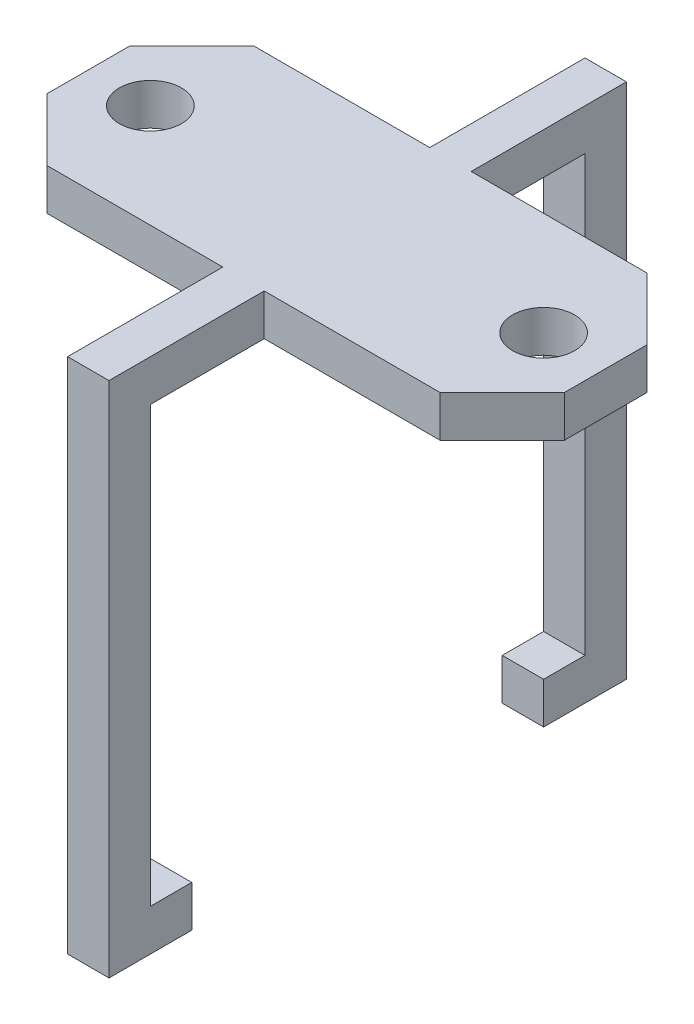
ISO-10303-21;
HEADER;
FILE_DESCRIPTION(('STEP AP214'),'2;1');
FILE_NAME('part.step','',(''),(''),'','','');
FILE_SCHEMA(('AUTOMOTIVE_DESIGN { 1 0 10303 214 1 1 1 1 }'));
ENDSEC;
DATA;
#1=APPLICATION_CONTEXT('core data for automotive mechanical design processes');
#2=APPLICATION_PROTOCOL_DEFINITION('international standard','automotive_design',2000,#1);
#3=PRODUCT_CONTEXT('',#1,'mechanical');
#4=PRODUCT('Part','Part','',(#3));
#5=PRODUCT_RELATED_PRODUCT_CATEGORY('part','',(#4));
#6=PRODUCT_DEFINITION_FORMATION('','',#4);
#7=PRODUCT_DEFINITION_CONTEXT('part definition',#1,'design');
#8=PRODUCT_DEFINITION('design','',#6,#7);
#9=PRODUCT_DEFINITION_SHAPE('','',#8);
#10=(LENGTH_UNIT() NAMED_UNIT(*) SI_UNIT(.MILLI.,.METRE.));
#11=(NAMED_UNIT(*) PLANE_ANGLE_UNIT() SI_UNIT($,.RADIAN.));
#12=(NAMED_UNIT(*) SI_UNIT($,.STERADIAN.) SOLID_ANGLE_UNIT());
#13=UNCERTAINTY_MEASURE_WITH_UNIT(LENGTH_MEASURE(1.E-05),#10,'distance_accuracy_value','');
#14=(GEOMETRIC_REPRESENTATION_CONTEXT(3) GLOBAL_UNCERTAINTY_ASSIGNED_CONTEXT((#13)) GLOBAL_UNIT_ASSIGNED_CONTEXT((#10,
#11,#12)) REPRESENTATION_CONTEXT('',''));
#15=CARTESIAN_POINT('',(0.,0.,0.));
#16=DIRECTION('',(0.,0.,1.));
#17=DIRECTION('',(1.,0.,0.));
#18=AXIS2_PLACEMENT_3D('',#15,#16,#17);
#19=CARTESIAN_POINT('',(-12.5,2.,-5.));
#20=DIRECTION('',(0.,0.,1.));
#21=DIRECTION('',(1.,0.,0.));
#22=AXIS2_PLACEMENT_3D('',#19,#20,#21);
#23=PLANE('',#22);
#24=DIRECTION('',(-1.,0.,0.));
#25=VECTOR('',#24,1.);
#26=CARTESIAN_POINT('',(-12.5,2.,-5.));
#27=LINE('',#26,#25);
#28=CARTESIAN_POINT('',(9.50000000000001,2.,-5.));
#29=VERTEX_POINT('',#28);
#30=CARTESIAN_POINT('',(1.,2.,-5.));
#31=VERTEX_POINT('',#30);
#32=EDGE_CURVE('E361',#29,#31,#27,.T.);
#33=ORIENTED_EDGE('',*,*,#32,.F.);
#34=DIRECTION('',(0.,-1.,0.));
#35=VECTOR('',#34,1.);
#36=CARTESIAN_POINT('',(9.50000000000001,2.,-5.));
#37=LINE('',#36,#35);
#38=CARTESIAN_POINT('',(9.50000000000001,0.,-5.));
#39=VERTEX_POINT('',#38);
#40=EDGE_CURVE('E371',#29,#39,#37,.T.);
#41=ORIENTED_EDGE('',*,*,#40,.T.);
#42=DIRECTION('',(-1.,0.,0.));
#43=VECTOR('',#42,1.);
#44=CARTESIAN_POINT('',(-12.5,0.,-5.));
#45=LINE('',#44,#43);
#46=CARTESIAN_POINT('',(1.,0.,-5.));
#47=VERTEX_POINT('',#46);
#48=EDGE_CURVE('E366',#39,#47,#45,.T.);
#49=ORIENTED_EDGE('',*,*,#48,.T.);
#50=DIRECTION('',(0.,-1.,0.));
#51=VECTOR('',#50,1.);
#52=CARTESIAN_POINT('',(1.,0.,-5.));
#53=LINE('',#52,#51);
#54=EDGE_CURVE('E241',#31,#47,#53,.T.);
#55=ORIENTED_EDGE('',*,*,#54,.F.);
#56=EDGE_LOOP('',(#33,#41,#49,#55));
#57=FACE_BOUND('',#56,.T.);
#58=ADVANCED_FACE('F39',(#57),#23,.F.);
#59=CARTESIAN_POINT('',(-12.5,2.,5.));
#60=DIRECTION('',(0.,0.,-1.));
#61=DIRECTION('',(-1.,0.,0.));
#62=AXIS2_PLACEMENT_3D('',#59,#60,#61);
#63=PLANE('',#62);
#64=DIRECTION('',(1.,0.,0.));
#65=VECTOR('',#64,1.);
#66=CARTESIAN_POINT('',(-12.5,2.,5.));
#67=LINE('',#66,#65);
#68=CARTESIAN_POINT('',(-9.50000000000001,2.,5.));
#69=VERTEX_POINT('',#68);
#70=CARTESIAN_POINT('',(-1.,2.,5.));
#71=VERTEX_POINT('',#70);
#72=EDGE_CURVE('E407',#69,#71,#67,.T.);
#73=ORIENTED_EDGE('',*,*,#72,.F.);
#74=DIRECTION('',(0.,-1.,0.));
#75=VECTOR('',#74,1.);
#76=CARTESIAN_POINT('',(-9.50000000000001,2.,5.));
#77=LINE('',#76,#75);
#78=CARTESIAN_POINT('',(-9.5,0.,5.));
#79=VERTEX_POINT('',#78);
#80=EDGE_CURVE('E11',#69,#79,#77,.T.);
#81=ORIENTED_EDGE('',*,*,#80,.T.);
#82=DIRECTION('',(1.,0.,0.));
#83=VECTOR('',#82,1.);
#84=CARTESIAN_POINT('',(-12.5,0.,5.));
#85=LINE('',#84,#83);
#86=CARTESIAN_POINT('',(-1.,0.,5.));
#87=VERTEX_POINT('',#86);
#88=EDGE_CURVE('E355',#79,#87,#85,.T.);
#89=ORIENTED_EDGE('',*,*,#88,.T.);
#90=DIRECTION('',(0.,-1.,0.));
#91=VECTOR('',#90,1.);
#92=CARTESIAN_POINT('',(-1.,0.,5.));
#93=LINE('',#92,#91);
#94=EDGE_CURVE('E311',#71,#87,#93,.T.);
#95=ORIENTED_EDGE('',*,*,#94,.F.);
#96=EDGE_LOOP('',(#73,#81,#89,#95));
#97=FACE_BOUND('',#96,.T.);
#98=ADVANCED_FACE('F497',(#97),#63,.F.);
#99=CARTESIAN_POINT('',(0.,2.,0.));
#100=DIRECTION('',(0.,-1.,0.));
#101=DIRECTION('',(0.,0.,-1.));
#102=AXIS2_PLACEMENT_3D('',#99,#100,#101);
#103=PLANE('',#102);
#104=DIRECTION('',(0.,0.,-1.));
#105=VECTOR('',#104,1.);
#106=CARTESIAN_POINT('',(12.5,2.,5.));
#107=LINE('',#106,#105);
#108=CARTESIAN_POINT('',(12.5,2.,1.99999999999999));
#109=VERTEX_POINT('',#108);
#110=CARTESIAN_POINT('',(12.5,2.,-2.));
#111=VERTEX_POINT('',#110);
#112=EDGE_CURVE('E353',#109,#111,#107,.T.);
#113=ORIENTED_EDGE('',*,*,#112,.T.);
#114=DIRECTION('',(0.707106781186547,0.,0.707106781186548));
#115=VECTOR('',#114,1.);
#116=CARTESIAN_POINT('',(9.50000000000001,2.,-5.));
#117=LINE('',#116,#115);
#118=EDGE_CURVE('E400',#111,#29,#117,.F.);
#119=ORIENTED_EDGE('',*,*,#118,.T.);
#120=ORIENTED_EDGE('',*,*,#32,.T.);
#121=DIRECTION('',(0.,0.,-1.));
#122=VECTOR('',#121,1.);
#123=CARTESIAN_POINT('',(1.,2.,0.));
#124=LINE('',#123,#122);
#125=CARTESIAN_POINT('',(1.,2.,-12.5));
#126=VERTEX_POINT('',#125);
#127=EDGE_CURVE('E235',#31,#126,#124,.T.);
#128=ORIENTED_EDGE('',*,*,#127,.T.);
#129=DIRECTION('',(-1.,0.,0.));
#130=VECTOR('',#129,1.);
#131=CARTESIAN_POINT('',(1.,2.,-12.5));
#132=LINE('',#131,#130);
#133=CARTESIAN_POINT('',(-1.,2.,-12.5));
#134=VERTEX_POINT('',#133);
#135=EDGE_CURVE('E276',#126,#134,#132,.T.);
#136=ORIENTED_EDGE('',*,*,#135,.T.);
#137=DIRECTION('',(0.,0.,-1.));
#138=VECTOR('',#137,1.);
#139=CARTESIAN_POINT('',(-1.,2.,0.));
#140=LINE('',#139,#138);
#141=CARTESIAN_POINT('',(-1.,2.,-5.));
#142=VERTEX_POINT('',#141);
#143=EDGE_CURVE('E260',#142,#134,#140,.T.);
#144=ORIENTED_EDGE('',*,*,#143,.F.);
#145=CARTESIAN_POINT('',(-9.49999999999998,2.,-5.));
#146=VERTEX_POINT('',#145);
#147=EDGE_CURVE('E246',#142,#146,#27,.T.);
#148=ORIENTED_EDGE('',*,*,#147,.T.);
#149=DIRECTION('',(0.707106781186549,0.,-0.707106781186546));
#150=VECTOR('',#149,1.);
#151=CARTESIAN_POINT('',(-12.5,2.,-1.99999999999999));
#152=LINE('',#151,#150);
#153=CARTESIAN_POINT('',(-12.5,2.,-1.99999999999999));
#154=VERTEX_POINT('',#153);
#155=EDGE_CURVE('E402',#146,#154,#152,.F.);
#156=ORIENTED_EDGE('',*,*,#155,.T.);
#157=DIRECTION('',(0.,0.,1.));
#158=VECTOR('',#157,1.);
#159=CARTESIAN_POINT('',(-12.5,2.,5.));
#160=LINE('',#159,#158);
#161=CARTESIAN_POINT('',(-12.5,2.,2.));
#162=VERTEX_POINT('',#161);
#163=EDGE_CURVE('E358',#154,#162,#160,.T.);
#164=ORIENTED_EDGE('',*,*,#163,.T.);
#165=DIRECTION('',(-0.707106781186547,0.,-0.707106781186548));
#166=VECTOR('',#165,1.);
#167=CARTESIAN_POINT('',(-9.50000000000001,2.,5.));
#168=LINE('',#167,#166);
#169=EDGE_CURVE('E62',#162,#69,#168,.F.);
#170=ORIENTED_EDGE('',*,*,#169,.T.);
#171=ORIENTED_EDGE('',*,*,#72,.T.);
#172=DIRECTION('',(0.,0.,-1.));
#173=VECTOR('',#172,1.);
#174=CARTESIAN_POINT('',(-1.,2.,0.));
#175=LINE('',#174,#173);
#176=CARTESIAN_POINT('',(-1.,2.,12.5));
#177=VERTEX_POINT('',#176);
#178=EDGE_CURVE('E214',#177,#71,#175,.T.);
#179=ORIENTED_EDGE('',*,*,#178,.F.);
#180=DIRECTION('',(-1.,0.,0.));
#181=VECTOR('',#180,1.);
#182=CARTESIAN_POINT('',(1.,2.,12.5));
#183=LINE('',#182,#181);
#184=CARTESIAN_POINT('',(1.,2.,12.5));
#185=VERTEX_POINT('',#184);
#186=EDGE_CURVE('E338',#185,#177,#183,.T.);
#187=ORIENTED_EDGE('',*,*,#186,.F.);
#188=DIRECTION('',(0.,0.,-1.));
#189=VECTOR('',#188,1.);
#190=CARTESIAN_POINT('',(1.,2.,0.));
#191=LINE('',#190,#189);
#192=CARTESIAN_POINT('',(1.,2.,5.));
#193=VERTEX_POINT('',#192);
#194=EDGE_CURVE('E283',#185,#193,#191,.T.);
#195=ORIENTED_EDGE('',*,*,#194,.T.);
#196=CARTESIAN_POINT('',(9.49999999999998,2.,5.));
#197=VERTEX_POINT('',#196);
#198=EDGE_CURVE('E304',#193,#197,#67,.T.);
#199=ORIENTED_EDGE('',*,*,#198,.T.);
#200=DIRECTION('',(-0.707106781186549,0.,0.707106781186546));
#201=VECTOR('',#200,1.);
#202=CARTESIAN_POINT('',(12.5,2.,1.99999999999999));
#203=LINE('',#202,#201);
#204=EDGE_CURVE('E412',#197,#109,#203,.F.);
#205=ORIENTED_EDGE('',*,*,#204,.T.);
#206=EDGE_LOOP('',(#113,#119,#120,#128,#136,#144,#148,#156,#164,#170,#171,#179,#187,#195,#199,#205));
#207=FACE_BOUND('',#206,.T.);
#208=CARTESIAN_POINT('',(-9.5,2.,0.));
#209=DIRECTION('',(0.,1.,0.));
#210=DIRECTION('',(0.,0.,1.));
#211=AXIS2_PLACEMENT_3D('',#208,#209,#210);
#212=CIRCLE('',#211,1.5);
#213=CARTESIAN_POINT('',(-9.5,2.,1.5));
#214=VERTEX_POINT('',#213);
#215=EDGE_CURVE('E347',#214,#214,#212,.T.);
#216=ORIENTED_EDGE('',*,*,#215,.F.);
#217=EDGE_LOOP('',(#216));
#218=FACE_BOUND('',#217,.T.);
#219=CARTESIAN_POINT('',(9.5,2.,0.));
#220=DIRECTION('',(0.,1.,0.));
#221=DIRECTION('',(0.,0.,1.));
#222=AXIS2_PLACEMENT_3D('',#219,#220,#221);
#223=CIRCLE('',#222,1.5);
#224=CARTESIAN_POINT('',(9.5,2.,1.5));
#225=VERTEX_POINT('',#224);
#226=EDGE_CURVE('E341',#225,#225,#223,.T.);
#227=ORIENTED_EDGE('',*,*,#226,.F.);
#228=EDGE_LOOP('',(#227));
#229=FACE_BOUND('',#228,.T.);
#230=ADVANCED_FACE('F426',(#207,#218,#229),#103,.F.);
#231=CARTESIAN_POINT('',(0.,0.,0.));
#232=DIRECTION('',(0.,-1.,0.));
#233=DIRECTION('',(0.,0.,-1.));
#234=AXIS2_PLACEMENT_3D('',#231,#232,#233);
#235=PLANE('',#234);
#236=CARTESIAN_POINT('',(-9.5,0.,0.));
#237=DIRECTION('',(0.,1.,0.));
#238=DIRECTION('',(0.,0.,1.));
#239=AXIS2_PLACEMENT_3D('',#236,#237,#238);
#240=CIRCLE('',#239,1.5);
#241=CARTESIAN_POINT('',(-9.5,0.,1.5));
#242=VERTEX_POINT('',#241);
#243=EDGE_CURVE('E344',#242,#242,#240,.T.);
#244=ORIENTED_EDGE('',*,*,#243,.T.);
#245=EDGE_LOOP('',(#244));
#246=FACE_BOUND('',#245,.T.);
#247=ORIENTED_EDGE('',*,*,#48,.F.);
#248=DIRECTION('',(-0.707106781186547,0.,-0.707106781186548));
#249=VECTOR('',#248,1.);
#250=CARTESIAN_POINT('',(7.25000000000001,0.,-7.25));
#251=LINE('',#250,#249);
#252=CARTESIAN_POINT('',(12.5,0.,-2.));
#253=VERTEX_POINT('',#252);
#254=EDGE_CURVE('E398',#39,#253,#251,.F.);
#255=ORIENTED_EDGE('',*,*,#254,.T.);
#256=DIRECTION('',(0.,0.,-1.));
#257=VECTOR('',#256,1.);
#258=CARTESIAN_POINT('',(12.5,0.,5.));
#259=LINE('',#258,#257);
#260=CARTESIAN_POINT('',(12.5,0.,1.99999999999999));
#261=VERTEX_POINT('',#260);
#262=EDGE_CURVE('E350',#261,#253,#259,.T.);
#263=ORIENTED_EDGE('',*,*,#262,.F.);
#264=DIRECTION('',(0.707106781186549,0.,-0.707106781186546));
#265=VECTOR('',#264,1.);
#266=CARTESIAN_POINT('',(7.24999999999997,0.,7.25));
#267=LINE('',#266,#265);
#268=CARTESIAN_POINT('',(9.49999999999998,0.,5.));
#269=VERTEX_POINT('',#268);
#270=EDGE_CURVE('E450',#261,#269,#267,.F.);
#271=ORIENTED_EDGE('',*,*,#270,.T.);
#272=CARTESIAN_POINT('',(1.,0.,5.));
#273=VERTEX_POINT('',#272);
#274=EDGE_CURVE('E443',#273,#269,#85,.T.);
#275=ORIENTED_EDGE('',*,*,#274,.F.);
#276=DIRECTION('',(0.,0.,-1.));
#277=VECTOR('',#276,1.);
#278=CARTESIAN_POINT('',(1.,0.,0.));
#279=LINE('',#278,#277);
#280=CARTESIAN_POINT('',(1.,0.,10.5));
#281=VERTEX_POINT('',#280);
#282=EDGE_CURVE('E293',#281,#273,#279,.T.);
#283=ORIENTED_EDGE('',*,*,#282,.F.);
#284=DIRECTION('',(-1.,0.,0.));
#285=VECTOR('',#284,1.);
#286=CARTESIAN_POINT('',(1.,0.,10.5));
#287=LINE('',#286,#285);
#288=CARTESIAN_POINT('',(-1.,0.,10.5));
#289=VERTEX_POINT('',#288);
#290=EDGE_CURVE('E303',#281,#289,#287,.T.);
#291=ORIENTED_EDGE('',*,*,#290,.T.);
#292=DIRECTION('',(0.,0.,-1.));
#293=VECTOR('',#292,1.);
#294=CARTESIAN_POINT('',(-1.,0.,0.));
#295=LINE('',#294,#293);
#296=EDGE_CURVE('E321',#289,#87,#295,.T.);
#297=ORIENTED_EDGE('',*,*,#296,.T.);
#298=ORIENTED_EDGE('',*,*,#88,.F.);
#299=DIRECTION('',(0.707106781186547,0.,0.707106781186548));
#300=VECTOR('',#299,1.);
#301=CARTESIAN_POINT('',(-7.25000000000001,0.,7.25));
#302=LINE('',#301,#300);
#303=CARTESIAN_POINT('',(-12.5,0.,2.));
#304=VERTEX_POINT('',#303);
#305=EDGE_CURVE('E442',#79,#304,#302,.F.);
#306=ORIENTED_EDGE('',*,*,#305,.T.);
#307=DIRECTION('',(0.,0.,1.));
#308=VECTOR('',#307,1.);
#309=CARTESIAN_POINT('',(-12.5,0.,5.));
#310=LINE('',#309,#308);
#311=CARTESIAN_POINT('',(-12.5,0.,-1.99999999999999));
#312=VERTEX_POINT('',#311);
#313=EDGE_CURVE('E369',#312,#304,#310,.T.);
#314=ORIENTED_EDGE('',*,*,#313,.F.);
#315=DIRECTION('',(-0.707106781186549,0.,0.707106781186546));
#316=VECTOR('',#315,1.);
#317=CARTESIAN_POINT('',(-7.24999999999997,0.,-7.25));
#318=LINE('',#317,#316);
#319=CARTESIAN_POINT('',(-9.49999999999998,0.,-5.));
#320=VERTEX_POINT('',#319);
#321=EDGE_CURVE('E432',#312,#320,#318,.F.);
#322=ORIENTED_EDGE('',*,*,#321,.T.);
#323=CARTESIAN_POINT('',(-1.,0.,-5.));
#324=VERTEX_POINT('',#323);
#325=EDGE_CURVE('E370',#324,#320,#45,.T.);
#326=ORIENTED_EDGE('',*,*,#325,.F.);
#327=DIRECTION('',(0.,0.,-1.));
#328=VECTOR('',#327,1.);
#329=CARTESIAN_POINT('',(-1.,0.,0.));
#330=LINE('',#329,#328);
#331=CARTESIAN_POINT('',(-1.,0.,-10.5));
#332=VERTEX_POINT('',#331);
#333=EDGE_CURVE('E259',#324,#332,#330,.T.);
#334=ORIENTED_EDGE('',*,*,#333,.T.);
#335=DIRECTION('',(-1.,0.,0.));
#336=VECTOR('',#335,1.);
#337=CARTESIAN_POINT('',(1.,0.,-10.5));
#338=LINE('',#337,#336);
#339=CARTESIAN_POINT('',(1.,0.,-10.5));
#340=VERTEX_POINT('',#339);
#341=EDGE_CURVE('E273',#340,#332,#338,.T.);
#342=ORIENTED_EDGE('',*,*,#341,.F.);
#343=DIRECTION('',(0.,0.,-1.));
#344=VECTOR('',#343,1.);
#345=CARTESIAN_POINT('',(1.,0.,0.));
#346=LINE('',#345,#344);
#347=EDGE_CURVE('E245',#47,#340,#346,.T.);
#348=ORIENTED_EDGE('',*,*,#347,.F.);
#349=EDGE_LOOP('',(#247,#255,#263,#271,#275,#283,#291,#297,#298,#306,#314,#322,#326,#334,#342,#348));
#350=FACE_BOUND('',#349,.T.);
#351=CARTESIAN_POINT('',(9.5,0.,0.));
#352=DIRECTION('',(0.,1.,0.));
#353=DIRECTION('',(0.,0.,1.));
#354=AXIS2_PLACEMENT_3D('',#351,#352,#353);
#355=CIRCLE('',#354,1.5);
#356=CARTESIAN_POINT('',(9.5,0.,1.5));
#357=VERTEX_POINT('',#356);
#358=EDGE_CURVE('E340',#357,#357,#355,.T.);
#359=ORIENTED_EDGE('',*,*,#358,.T.);
#360=EDGE_LOOP('',(#359));
#361=FACE_BOUND('',#360,.T.);
#362=ADVANCED_FACE('F439',(#246,#350,#361),#235,.T.);
#363=CARTESIAN_POINT('',(12.5,2.,5.));
#364=DIRECTION('',(-1.,0.,0.));
#365=DIRECTION('',(0.,0.,1.));
#366=AXIS2_PLACEMENT_3D('',#363,#364,#365);
#367=PLANE('',#366);
#368=ORIENTED_EDGE('',*,*,#262,.T.);
#369=DIRECTION('',(0.,1.,0.));
#370=VECTOR('',#369,1.);
#371=CARTESIAN_POINT('',(12.5,2.,-2.));
#372=LINE('',#371,#370);
#373=EDGE_CURVE('E390',#253,#111,#372,.T.);
#374=ORIENTED_EDGE('',*,*,#373,.T.);
#375=ORIENTED_EDGE('',*,*,#112,.F.);
#376=DIRECTION('',(0.,-1.,0.));
#377=VECTOR('',#376,1.);
#378=CARTESIAN_POINT('',(12.5,2.,1.99999999999999));
#379=LINE('',#378,#377);
#380=EDGE_CURVE('E392',#109,#261,#379,.T.);
#381=ORIENTED_EDGE('',*,*,#380,.T.);
#382=EDGE_LOOP('',(#368,#374,#375,#381));
#383=FACE_BOUND('',#382,.T.);
#384=ADVANCED_FACE('F388',(#383),#367,.F.);
#385=ORIENTED_EDGE('',*,*,#325,.T.);
#386=DIRECTION('',(0.,1.,0.));
#387=VECTOR('',#386,1.);
#388=CARTESIAN_POINT('',(-9.49999999999998,2.,-5.));
#389=LINE('',#388,#387);
#390=EDGE_CURVE('E47',#320,#146,#389,.T.);
#391=ORIENTED_EDGE('',*,*,#390,.T.);
#392=ORIENTED_EDGE('',*,*,#147,.F.);
#393=DIRECTION('',(0.,-1.,0.));
#394=VECTOR('',#393,1.);
#395=CARTESIAN_POINT('',(-1.,0.,-5.));
#396=LINE('',#395,#394);
#397=EDGE_CURVE('E256',#142,#324,#396,.T.);
#398=ORIENTED_EDGE('',*,*,#397,.T.);
#399=EDGE_LOOP('',(#385,#391,#392,#398));
#400=FACE_BOUND('',#399,.T.);
#401=ADVANCED_FACE('F421',(#400),#23,.F.);
#402=CARTESIAN_POINT('',(-12.5,2.,5.));
#403=DIRECTION('',(1.,0.,0.));
#404=DIRECTION('',(0.,0.,-1.));
#405=AXIS2_PLACEMENT_3D('',#402,#403,#404);
#406=PLANE('',#405);
#407=ORIENTED_EDGE('',*,*,#163,.F.);
#408=DIRECTION('',(0.,-1.,0.));
#409=VECTOR('',#408,1.);
#410=CARTESIAN_POINT('',(-12.5,2.,-1.99999999999999));
#411=LINE('',#410,#409);
#412=EDGE_CURVE('E418',#154,#312,#411,.T.);
#413=ORIENTED_EDGE('',*,*,#412,.T.);
#414=ORIENTED_EDGE('',*,*,#313,.T.);
#415=DIRECTION('',(0.,1.,0.));
#416=VECTOR('',#415,1.);
#417=CARTESIAN_POINT('',(-12.5,2.,2.));
#418=LINE('',#417,#416);
#419=EDGE_CURVE('E416',#304,#162,#418,.T.);
#420=ORIENTED_EDGE('',*,*,#419,.T.);
#421=EDGE_LOOP('',(#407,#413,#414,#420));
#422=FACE_BOUND('',#421,.T.);
#423=ADVANCED_FACE('F436',(#422),#406,.F.);
#424=ORIENTED_EDGE('',*,*,#274,.T.);
#425=DIRECTION('',(0.,1.,0.));
#426=VECTOR('',#425,1.);
#427=CARTESIAN_POINT('',(9.49999999999998,2.,5.));
#428=LINE('',#427,#426);
#429=EDGE_CURVE('E54',#269,#197,#428,.T.);
#430=ORIENTED_EDGE('',*,*,#429,.T.);
#431=ORIENTED_EDGE('',*,*,#198,.F.);
#432=DIRECTION('',(0.,-1.,0.));
#433=VECTOR('',#432,1.);
#434=CARTESIAN_POINT('',(1.,0.,5.));
#435=LINE('',#434,#433);
#436=EDGE_CURVE('E299',#193,#273,#435,.T.);
#437=ORIENTED_EDGE('',*,*,#436,.T.);
#438=EDGE_LOOP('',(#424,#430,#431,#437));
#439=FACE_BOUND('',#438,.T.);
#440=ADVANCED_FACE('F499',(#439),#63,.F.);
#441=CARTESIAN_POINT('',(-9.5,2.,0.));
#442=DIRECTION('',(0.,-1.,0.));
#443=DIRECTION('',(0.,0.,-1.));
#444=AXIS2_PLACEMENT_3D('',#441,#442,#443);
#445=CYLINDRICAL_SURFACE('',#444,1.5);
#446=ORIENTED_EDGE('',*,*,#215,.T.);
#447=EDGE_LOOP('',(#446));
#448=FACE_BOUND('',#447,.T.);
#449=ORIENTED_EDGE('',*,*,#243,.F.);
#450=EDGE_LOOP('',(#449));
#451=FACE_BOUND('',#450,.T.);
#452=ADVANCED_FACE('F571',(#448,#451),#445,.F.);
#453=CARTESIAN_POINT('',(9.5,2.,0.));
#454=DIRECTION('',(0.,-1.,0.));
#455=DIRECTION('',(0.,0.,-1.));
#456=AXIS2_PLACEMENT_3D('',#453,#454,#455);
#457=CYLINDRICAL_SURFACE('',#456,1.5);
#458=ORIENTED_EDGE('',*,*,#226,.T.);
#459=EDGE_LOOP('',(#458));
#460=FACE_BOUND('',#459,.T.);
#461=ORIENTED_EDGE('',*,*,#358,.F.);
#462=EDGE_LOOP('',(#461));
#463=FACE_BOUND('',#462,.T.);
#464=ADVANCED_FACE('F731',(#460,#463),#457,.F.);
#465=CARTESIAN_POINT('',(1.,0.,12.5));
#466=DIRECTION('',(0.,0.,1.));
#467=DIRECTION('',(1.,0.,0.));
#468=AXIS2_PLACEMENT_3D('',#465,#466,#467);
#469=PLANE('',#468);
#470=DIRECTION('',(0.,1.,0.));
#471=VECTOR('',#470,1.);
#472=CARTESIAN_POINT('',(-1.,0.,12.5));
#473=LINE('',#472,#471);
#474=CARTESIAN_POINT('',(-1.,-23.,12.5));
#475=VERTEX_POINT('',#474);
#476=EDGE_CURVE('E296',#475,#177,#473,.T.);
#477=ORIENTED_EDGE('',*,*,#476,.F.);
#478=DIRECTION('',(-1.,0.,0.));
#479=VECTOR('',#478,1.);
#480=CARTESIAN_POINT('',(1.,-23.,12.5));
#481=LINE('',#480,#479);
#482=CARTESIAN_POINT('',(1.,-23.,12.5));
#483=VERTEX_POINT('',#482);
#484=EDGE_CURVE('E336',#483,#475,#481,.T.);
#485=ORIENTED_EDGE('',*,*,#484,.F.);
#486=DIRECTION('',(0.,1.,0.));
#487=VECTOR('',#486,1.);
#488=CARTESIAN_POINT('',(1.,0.,12.5));
#489=LINE('',#488,#487);
#490=EDGE_CURVE('E279',#483,#185,#489,.T.);
#491=ORIENTED_EDGE('',*,*,#490,.T.);
#492=ORIENTED_EDGE('',*,*,#186,.T.);
#493=EDGE_LOOP('',(#477,#485,#491,#492));
#494=FACE_BOUND('',#493,.T.);
#495=ADVANCED_FACE('F492',(#494),#469,.T.);
#496=CARTESIAN_POINT('',(1.,-23.,0.));
#497=DIRECTION('',(0.,1.,0.));
#498=DIRECTION('',(0.,0.,1.));
#499=AXIS2_PLACEMENT_3D('',#496,#497,#498);
#500=PLANE('',#499);
#501=DIRECTION('',(0.,0.,-1.));
#502=VECTOR('',#501,1.);
#503=CARTESIAN_POINT('',(-1.,-23.,0.));
#504=LINE('',#503,#502);
#505=CARTESIAN_POINT('',(-1.,-23.,8.5));
#506=VERTEX_POINT('',#505);
#507=EDGE_CURVE('E481',#475,#506,#504,.T.);
#508=ORIENTED_EDGE('',*,*,#507,.T.);
#509=DIRECTION('',(-1.,0.,0.));
#510=VECTOR('',#509,1.);
#511=CARTESIAN_POINT('',(1.,-23.,8.5));
#512=LINE('',#511,#510);
#513=CARTESIAN_POINT('',(1.,-23.,8.5));
#514=VERTEX_POINT('',#513);
#515=EDGE_CURVE('E333',#514,#506,#512,.T.);
#516=ORIENTED_EDGE('',*,*,#515,.F.);
#517=DIRECTION('',(0.,0.,-1.));
#518=VECTOR('',#517,1.);
#519=CARTESIAN_POINT('',(1.,-23.,0.));
#520=LINE('',#519,#518);
#521=EDGE_CURVE('E282',#483,#514,#520,.T.);
#522=ORIENTED_EDGE('',*,*,#521,.F.);
#523=ORIENTED_EDGE('',*,*,#484,.T.);
#524=EDGE_LOOP('',(#508,#516,#522,#523));
#525=FACE_BOUND('',#524,.T.);
#526=ADVANCED_FACE('F502',(#525),#500,.F.);
#527=CARTESIAN_POINT('',(1.,0.,8.5));
#528=DIRECTION('',(0.,0.,1.));
#529=DIRECTION('',(1.,0.,0.));
#530=AXIS2_PLACEMENT_3D('',#527,#528,#529);
#531=PLANE('',#530);
#532=DIRECTION('',(0.,1.,0.));
#533=VECTOR('',#532,1.);
#534=CARTESIAN_POINT('',(-1.,0.,8.5));
#535=LINE('',#534,#533);
#536=CARTESIAN_POINT('',(-1.,-21.,8.5));
#537=VERTEX_POINT('',#536);
#538=EDGE_CURVE('E478',#506,#537,#535,.T.);
#539=ORIENTED_EDGE('',*,*,#538,.T.);
#540=DIRECTION('',(-1.,0.,0.));
#541=VECTOR('',#540,1.);
#542=CARTESIAN_POINT('',(1.,-21.,8.5));
#543=LINE('',#542,#541);
#544=CARTESIAN_POINT('',(1.,-21.,8.5));
#545=VERTEX_POINT('',#544);
#546=EDGE_CURVE('E331',#545,#537,#543,.T.);
#547=ORIENTED_EDGE('',*,*,#546,.F.);
#548=DIRECTION('',(0.,1.,0.));
#549=VECTOR('',#548,1.);
#550=CARTESIAN_POINT('',(1.,0.,8.5));
#551=LINE('',#550,#549);
#552=EDGE_CURVE('E285',#514,#545,#551,.T.);
#553=ORIENTED_EDGE('',*,*,#552,.F.);
#554=ORIENTED_EDGE('',*,*,#515,.T.);
#555=EDGE_LOOP('',(#539,#547,#553,#554));
#556=FACE_BOUND('',#555,.T.);
#557=ADVANCED_FACE('F504',(#556),#531,.F.);
#558=CARTESIAN_POINT('',(1.,-21.,0.));
#559=DIRECTION('',(0.,1.,0.));
#560=DIRECTION('',(0.,0.,1.));
#561=AXIS2_PLACEMENT_3D('',#558,#559,#560);
#562=PLANE('',#561);
#563=DIRECTION('',(0.,0.,-1.));
#564=VECTOR('',#563,1.);
#565=CARTESIAN_POINT('',(-1.,-21.,0.));
#566=LINE('',#565,#564);
#567=CARTESIAN_POINT('',(-1.,-21.,10.5));
#568=VERTEX_POINT('',#567);
#569=EDGE_CURVE('E477',#568,#537,#566,.T.);
#570=ORIENTED_EDGE('',*,*,#569,.F.);
#571=DIRECTION('',(-1.,0.,0.));
#572=VECTOR('',#571,1.);
#573=CARTESIAN_POINT('',(1.,-21.,10.5));
#574=LINE('',#573,#572);
#575=CARTESIAN_POINT('',(1.,-21.,10.5));
#576=VERTEX_POINT('',#575);
#577=EDGE_CURVE('E329',#576,#568,#574,.T.);
#578=ORIENTED_EDGE('',*,*,#577,.F.);
#579=DIRECTION('',(0.,0.,-1.));
#580=VECTOR('',#579,1.);
#581=CARTESIAN_POINT('',(1.,-21.,0.));
#582=LINE('',#581,#580);
#583=EDGE_CURVE('E287',#576,#545,#582,.T.);
#584=ORIENTED_EDGE('',*,*,#583,.T.);
#585=ORIENTED_EDGE('',*,*,#546,.T.);
#586=EDGE_LOOP('',(#570,#578,#584,#585));
#587=FACE_BOUND('',#586,.T.);
#588=ADVANCED_FACE('F506',(#587),#562,.T.);
#589=CARTESIAN_POINT('',(1.,0.,10.5));
#590=DIRECTION('',(0.,0.,-1.));
#591=DIRECTION('',(0.,1.,0.));
#592=AXIS2_PLACEMENT_3D('',#589,#590,#591);
#593=PLANE('',#592);
#594=DIRECTION('',(0.,-1.,0.));
#595=VECTOR('',#594,1.);
#596=CARTESIAN_POINT('',(-1.,0.,10.5));
#597=LINE('',#596,#595);
#598=EDGE_CURVE('E326',#289,#568,#597,.T.);
#599=ORIENTED_EDGE('',*,*,#598,.F.);
#600=ORIENTED_EDGE('',*,*,#290,.F.);
#601=DIRECTION('',(0.,-1.,0.));
#602=VECTOR('',#601,1.);
#603=CARTESIAN_POINT('',(1.,0.,10.5));
#604=LINE('',#603,#602);
#605=EDGE_CURVE('E290',#281,#576,#604,.T.);
#606=ORIENTED_EDGE('',*,*,#605,.T.);
#607=ORIENTED_EDGE('',*,*,#577,.T.);
#608=EDGE_LOOP('',(#599,#600,#606,#607));
#609=FACE_BOUND('',#608,.T.);
#610=ADVANCED_FACE('F472',(#609),#593,.T.);
#611=CARTESIAN_POINT('',(1.,0.,0.));
#612=DIRECTION('',(1.,0.,0.));
#613=DIRECTION('',(0.,0.,-1.));
#614=AXIS2_PLACEMENT_3D('',#611,#612,#613);
#615=PLANE('',#614);
#616=ORIENTED_EDGE('',*,*,#194,.F.);
#617=ORIENTED_EDGE('',*,*,#490,.F.);
#618=ORIENTED_EDGE('',*,*,#521,.T.);
#619=ORIENTED_EDGE('',*,*,#552,.T.);
#620=ORIENTED_EDGE('',*,*,#583,.F.);
#621=ORIENTED_EDGE('',*,*,#605,.F.);
#622=ORIENTED_EDGE('',*,*,#282,.T.);
#623=ORIENTED_EDGE('',*,*,#436,.F.);
#624=EDGE_LOOP('',(#616,#617,#618,#619,#620,#621,#622,#623));
#625=FACE_BOUND('',#624,.T.);
#626=ADVANCED_FACE('F469',(#625),#615,.T.);
#627=CARTESIAN_POINT('',(-1.,0.,0.));
#628=DIRECTION('',(1.,0.,0.));
#629=DIRECTION('',(0.,0.,-1.));
#630=AXIS2_PLACEMENT_3D('',#627,#628,#629);
#631=PLANE('',#630);
#632=ORIENTED_EDGE('',*,*,#178,.T.);
#633=ORIENTED_EDGE('',*,*,#94,.T.);
#634=ORIENTED_EDGE('',*,*,#296,.F.);
#635=ORIENTED_EDGE('',*,*,#598,.T.);
#636=ORIENTED_EDGE('',*,*,#569,.T.);
#637=ORIENTED_EDGE('',*,*,#538,.F.);
#638=ORIENTED_EDGE('',*,*,#507,.F.);
#639=ORIENTED_EDGE('',*,*,#476,.T.);
#640=EDGE_LOOP('',(#632,#633,#634,#635,#636,#637,#638,#639));
#641=FACE_BOUND('',#640,.T.);
#642=ADVANCED_FACE('F488',(#641),#631,.F.);
#643=CARTESIAN_POINT('',(1.,0.,-8.5));
#644=DIRECTION('',(0.,0.,1.));
#645=DIRECTION('',(1.,0.,0.));
#646=AXIS2_PLACEMENT_3D('',#643,#644,#645);
#647=PLANE('',#646);
#648=DIRECTION('',(0.,1.,0.));
#649=VECTOR('',#648,1.);
#650=CARTESIAN_POINT('',(-1.,0.,-8.5));
#651=LINE('',#650,#649);
#652=CARTESIAN_POINT('',(-1.,-23.,-8.5));
#653=VERTEX_POINT('',#652);
#654=CARTESIAN_POINT('',(-1.,-21.,-8.5));
#655=VERTEX_POINT('',#654);
#656=EDGE_CURVE('E210',#653,#655,#651,.T.);
#657=ORIENTED_EDGE('',*,*,#656,.F.);
#658=DIRECTION('',(-1.,0.,0.));
#659=VECTOR('',#658,1.);
#660=CARTESIAN_POINT('',(1.,-23.,-8.5));
#661=LINE('',#660,#659);
#662=CARTESIAN_POINT('',(1.,-23.,-8.5));
#663=VERTEX_POINT('',#662);
#664=EDGE_CURVE('E203',#663,#653,#661,.T.);
#665=ORIENTED_EDGE('',*,*,#664,.F.);
#666=DIRECTION('',(0.,1.,0.));
#667=VECTOR('',#666,1.);
#668=CARTESIAN_POINT('',(1.,0.,-8.5));
#669=LINE('',#668,#667);
#670=CARTESIAN_POINT('',(1.,-21.,-8.5));
#671=VERTEX_POINT('',#670);
#672=EDGE_CURVE('E207',#663,#671,#669,.T.);
#673=ORIENTED_EDGE('',*,*,#672,.T.);
#674=DIRECTION('',(-1.,0.,0.));
#675=VECTOR('',#674,1.);
#676=CARTESIAN_POINT('',(1.,-21.,-8.5));
#677=LINE('',#676,#675);
#678=EDGE_CURVE('E269',#671,#655,#677,.T.);
#679=ORIENTED_EDGE('',*,*,#678,.T.);
#680=EDGE_LOOP('',(#657,#665,#673,#679));
#681=FACE_BOUND('',#680,.T.);
#682=ADVANCED_FACE('F205',(#681),#647,.T.);
#683=CARTESIAN_POINT('',(1.,-23.,0.));
#684=DIRECTION('',(0.,1.,0.));
#685=DIRECTION('',(0.,0.,1.));
#686=AXIS2_PLACEMENT_3D('',#683,#684,#685);
#687=PLANE('',#686);
#688=DIRECTION('',(0.,0.,-1.));
#689=VECTOR('',#688,1.);
#690=CARTESIAN_POINT('',(-1.,-23.,0.));
#691=LINE('',#690,#689);
#692=CARTESIAN_POINT('',(-1.,-23.,-12.5));
#693=VERTEX_POINT('',#692);
#694=EDGE_CURVE('E770',#653,#693,#691,.T.);
#695=ORIENTED_EDGE('',*,*,#694,.T.);
#696=DIRECTION('',(-1.,0.,0.));
#697=VECTOR('',#696,1.);
#698=CARTESIAN_POINT('',(1.,-23.,-12.5));
#699=LINE('',#698,#697);
#700=CARTESIAN_POINT('',(1.,-23.,-12.5));
#701=VERTEX_POINT('',#700);
#702=EDGE_CURVE('E215',#701,#693,#699,.T.);
#703=ORIENTED_EDGE('',*,*,#702,.F.);
#704=DIRECTION('',(0.,0.,-1.));
#705=VECTOR('',#704,1.);
#706=CARTESIAN_POINT('',(1.,-23.,0.));
#707=LINE('',#706,#705);
#708=EDGE_CURVE('E218',#663,#701,#707,.T.);
#709=ORIENTED_EDGE('',*,*,#708,.F.);
#710=ORIENTED_EDGE('',*,*,#664,.T.);
#711=EDGE_LOOP('',(#695,#703,#709,#710));
#712=FACE_BOUND('',#711,.T.);
#713=ADVANCED_FACE('F219',(#712),#687,.F.);
#714=CARTESIAN_POINT('',(1.,0.,-12.5));
#715=DIRECTION('',(0.,0.,-1.));
#716=DIRECTION('',(0.,1.,0.));
#717=AXIS2_PLACEMENT_3D('',#714,#715,#716);
#718=PLANE('',#717);
#719=DIRECTION('',(0.,-1.,0.));
#720=VECTOR('',#719,1.);
#721=CARTESIAN_POINT('',(-1.,0.,-12.5));
#722=LINE('',#721,#720);
#723=EDGE_CURVE('E265',#134,#693,#722,.T.);
#724=ORIENTED_EDGE('',*,*,#723,.F.);
#725=ORIENTED_EDGE('',*,*,#135,.F.);
#726=DIRECTION('',(0.,-1.,0.));
#727=VECTOR('',#726,1.);
#728=CARTESIAN_POINT('',(1.,0.,-12.5));
#729=LINE('',#728,#727);
#730=EDGE_CURVE('E223',#126,#701,#729,.T.);
#731=ORIENTED_EDGE('',*,*,#730,.T.);
#732=ORIENTED_EDGE('',*,*,#702,.T.);
#733=EDGE_LOOP('',(#724,#725,#731,#732));
#734=FACE_BOUND('',#733,.T.);
#735=ADVANCED_FACE('F653',(#734),#718,.T.);
#736=CARTESIAN_POINT('',(1.,0.,-10.5));
#737=DIRECTION('',(0.,0.,-1.));
#738=DIRECTION('',(0.,1.,0.));
#739=AXIS2_PLACEMENT_3D('',#736,#737,#738);
#740=PLANE('',#739);
#741=DIRECTION('',(0.,-1.,0.));
#742=VECTOR('',#741,1.);
#743=CARTESIAN_POINT('',(-1.,0.,-10.5));
#744=LINE('',#743,#742);
#745=CARTESIAN_POINT('',(-1.,-21.,-10.5));
#746=VERTEX_POINT('',#745);
#747=EDGE_CURVE('E231',#332,#746,#744,.T.);
#748=ORIENTED_EDGE('',*,*,#747,.T.);
#749=DIRECTION('',(-1.,0.,0.));
#750=VECTOR('',#749,1.);
#751=CARTESIAN_POINT('',(1.,-21.,-10.5));
#752=LINE('',#751,#750);
#753=CARTESIAN_POINT('',(1.,-21.,-10.5));
#754=VERTEX_POINT('',#753);
#755=EDGE_CURVE('E271',#754,#746,#752,.T.);
#756=ORIENTED_EDGE('',*,*,#755,.F.);
#757=DIRECTION('',(0.,-1.,0.));
#758=VECTOR('',#757,1.);
#759=CARTESIAN_POINT('',(1.,0.,-10.5));
#760=LINE('',#759,#758);
#761=EDGE_CURVE('E238',#340,#754,#760,.T.);
#762=ORIENTED_EDGE('',*,*,#761,.F.);
#763=ORIENTED_EDGE('',*,*,#341,.T.);
#764=EDGE_LOOP('',(#748,#756,#762,#763));
#765=FACE_BOUND('',#764,.T.);
#766=ADVANCED_FACE('F643',(#765),#740,.F.);
#767=CARTESIAN_POINT('',(1.,-21.,0.));
#768=DIRECTION('',(0.,1.,0.));
#769=DIRECTION('',(0.,0.,1.));
#770=AXIS2_PLACEMENT_3D('',#767,#768,#769);
#771=PLANE('',#770);
#772=DIRECTION('',(0.,0.,-1.));
#773=VECTOR('',#772,1.);
#774=CARTESIAN_POINT('',(-1.,-21.,0.));
#775=LINE('',#774,#773);
#776=EDGE_CURVE('E228',#655,#746,#775,.T.);
#777=ORIENTED_EDGE('',*,*,#776,.F.);
#778=ORIENTED_EDGE('',*,*,#678,.F.);
#779=DIRECTION('',(0.,0.,-1.));
#780=VECTOR('',#779,1.);
#781=CARTESIAN_POINT('',(1.,-21.,0.));
#782=LINE('',#781,#780);
#783=EDGE_CURVE('E227',#671,#754,#782,.T.);
#784=ORIENTED_EDGE('',*,*,#783,.T.);
#785=ORIENTED_EDGE('',*,*,#755,.T.);
#786=EDGE_LOOP('',(#777,#778,#784,#785));
#787=FACE_BOUND('',#786,.T.);
#788=ADVANCED_FACE('F633',(#787),#771,.T.);
#789=CARTESIAN_POINT('',(1.,0.,0.));
#790=DIRECTION('',(1.,0.,0.));
#791=DIRECTION('',(0.,0.,-1.));
#792=AXIS2_PLACEMENT_3D('',#789,#790,#791);
#793=PLANE('',#792);
#794=ORIENTED_EDGE('',*,*,#672,.F.);
#795=ORIENTED_EDGE('',*,*,#708,.T.);
#796=ORIENTED_EDGE('',*,*,#730,.F.);
#797=ORIENTED_EDGE('',*,*,#127,.F.);
#798=ORIENTED_EDGE('',*,*,#54,.T.);
#799=ORIENTED_EDGE('',*,*,#347,.T.);
#800=ORIENTED_EDGE('',*,*,#761,.T.);
#801=ORIENTED_EDGE('',*,*,#783,.F.);
#802=EDGE_LOOP('',(#794,#795,#796,#797,#798,#799,#800,#801));
#803=FACE_BOUND('',#802,.T.);
#804=ADVANCED_FACE('F225',(#803),#793,.T.);
#805=CARTESIAN_POINT('',(-1.,0.,0.));
#806=DIRECTION('',(1.,0.,0.));
#807=DIRECTION('',(0.,0.,-1.));
#808=AXIS2_PLACEMENT_3D('',#805,#806,#807);
#809=PLANE('',#808);
#810=ORIENTED_EDGE('',*,*,#656,.T.);
#811=ORIENTED_EDGE('',*,*,#776,.T.);
#812=ORIENTED_EDGE('',*,*,#747,.F.);
#813=ORIENTED_EDGE('',*,*,#333,.F.);
#814=ORIENTED_EDGE('',*,*,#397,.F.);
#815=ORIENTED_EDGE('',*,*,#143,.T.);
#816=ORIENTED_EDGE('',*,*,#723,.T.);
#817=ORIENTED_EDGE('',*,*,#694,.F.);
#818=EDGE_LOOP('',(#810,#811,#812,#813,#814,#815,#816,#817));
#819=FACE_BOUND('',#818,.T.);
#820=ADVANCED_FACE('F536',(#819),#809,.F.);
#821=CARTESIAN_POINT('',(9.50000000000001,2.,-5.));
#822=DIRECTION('',(-0.707106781186548,0.,0.707106781186547));
#823=DIRECTION('',(0.,-1.,0.));
#824=AXIS2_PLACEMENT_3D('',#821,#822,#823);
#825=PLANE('',#824);
#826=ORIENTED_EDGE('',*,*,#118,.F.);
#827=ORIENTED_EDGE('',*,*,#373,.F.);
#828=ORIENTED_EDGE('',*,*,#254,.F.);
#829=ORIENTED_EDGE('',*,*,#40,.F.);
#830=EDGE_LOOP('',(#826,#827,#828,#829));
#831=FACE_BOUND('',#830,.T.);
#832=ADVANCED_FACE('F396',(#831),#825,.F.);
#833=CARTESIAN_POINT('',(12.5,2.,1.99999999999999));
#834=DIRECTION('',(-0.707106781186546,0.,-0.707106781186549));
#835=DIRECTION('',(0.,-1.,0.));
#836=AXIS2_PLACEMENT_3D('',#833,#834,#835);
#837=PLANE('',#836);
#838=ORIENTED_EDGE('',*,*,#204,.F.);
#839=ORIENTED_EDGE('',*,*,#429,.F.);
#840=ORIENTED_EDGE('',*,*,#270,.F.);
#841=ORIENTED_EDGE('',*,*,#380,.F.);
#842=EDGE_LOOP('',(#838,#839,#840,#841));
#843=FACE_BOUND('',#842,.T.);
#844=ADVANCED_FACE('F460',(#843),#837,.F.);
#845=CARTESIAN_POINT('',(-12.5,2.,-1.99999999999999));
#846=DIRECTION('',(0.707106781186546,0.,0.707106781186549));
#847=DIRECTION('',(0.,-1.,0.));
#848=AXIS2_PLACEMENT_3D('',#845,#846,#847);
#849=PLANE('',#848);
#850=ORIENTED_EDGE('',*,*,#155,.F.);
#851=ORIENTED_EDGE('',*,*,#390,.F.);
#852=ORIENTED_EDGE('',*,*,#321,.F.);
#853=ORIENTED_EDGE('',*,*,#412,.F.);
#854=EDGE_LOOP('',(#850,#851,#852,#853));
#855=FACE_BOUND('',#854,.T.);
#856=ADVANCED_FACE('F431',(#855),#849,.F.);
#857=CARTESIAN_POINT('',(-9.50000000000001,2.,5.));
#858=DIRECTION('',(0.707106781186548,0.,-0.707106781186547));
#859=DIRECTION('',(0.,-1.,0.));
#860=AXIS2_PLACEMENT_3D('',#857,#858,#859);
#861=PLANE('',#860);
#862=ORIENTED_EDGE('',*,*,#169,.F.);
#863=ORIENTED_EDGE('',*,*,#419,.F.);
#864=ORIENTED_EDGE('',*,*,#305,.F.);
#865=ORIENTED_EDGE('',*,*,#80,.F.);
#866=EDGE_LOOP('',(#862,#863,#864,#865));
#867=FACE_BOUND('',#866,.T.);
#868=ADVANCED_FACE('F41',(#867),#861,.F.);
#869=CLOSED_SHELL('',(#58,#98,#230,#362,#384,#401,#423,#440,#452,#464,#495,#526,#557,#588,#610,
#626,#642,#682,#713,#735,#766,#788,#804,#820,#832,#844,#856,#868));
#870=MANIFOLD_SOLID_BREP('B2',#869);
#871=ADVANCED_BREP_SHAPE_REPRESENTATION('',(#18,#870),#14);
#872=SHAPE_DEFINITION_REPRESENTATION(#9,#871);
ENDSEC;
END-ISO-10303-21;
